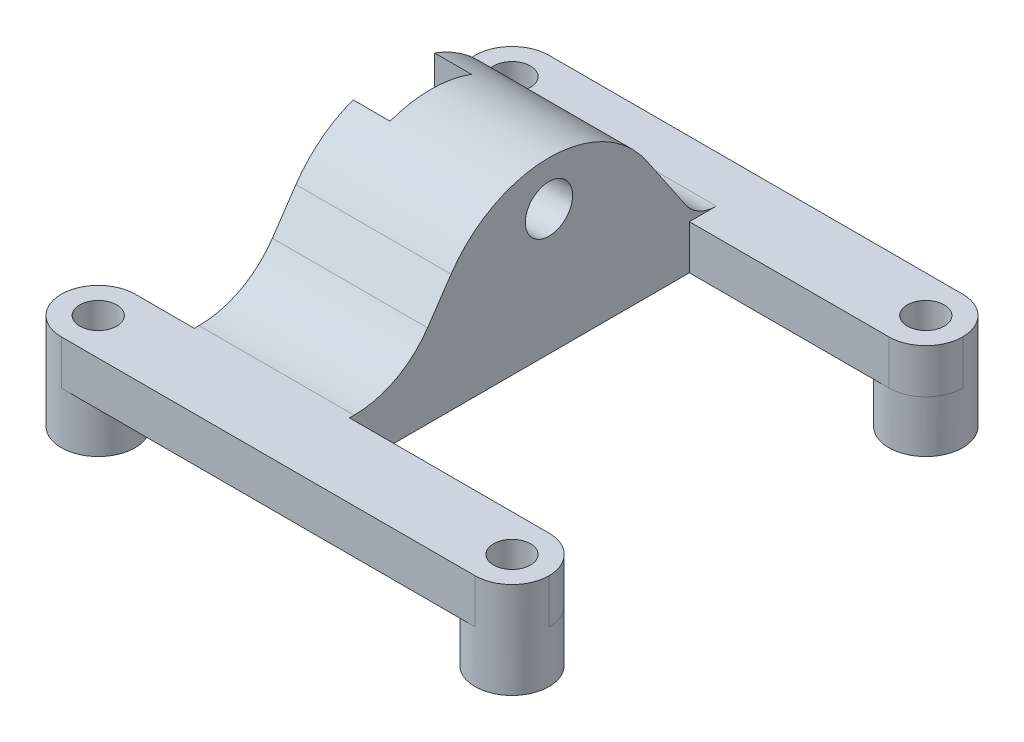
ISO-10303-21;
HEADER;
FILE_DESCRIPTION(('STEP AP214'),'2;1');
FILE_NAME('part.step','',(''),(''),'','','');
FILE_SCHEMA(('AUTOMOTIVE_DESIGN { 1 0 10303 214 1 1 1 1 }'));
ENDSEC;
DATA;
#1=APPLICATION_CONTEXT('core data for automotive mechanical design processes');
#2=APPLICATION_PROTOCOL_DEFINITION('international standard','automotive_design',2000,#1);
#3=PRODUCT_CONTEXT('',#1,'mechanical');
#4=PRODUCT('Part','Part','',(#3));
#5=PRODUCT_RELATED_PRODUCT_CATEGORY('part','',(#4));
#6=PRODUCT_DEFINITION_FORMATION('','',#4);
#7=PRODUCT_DEFINITION_CONTEXT('part definition',#1,'design');
#8=PRODUCT_DEFINITION('design','',#6,#7);
#9=PRODUCT_DEFINITION_SHAPE('','',#8);
#10=(LENGTH_UNIT() NAMED_UNIT(*) SI_UNIT(.MILLI.,.METRE.));
#11=(NAMED_UNIT(*) PLANE_ANGLE_UNIT() SI_UNIT($,.RADIAN.));
#12=(NAMED_UNIT(*) SI_UNIT($,.STERADIAN.) SOLID_ANGLE_UNIT());
#13=UNCERTAINTY_MEASURE_WITH_UNIT(LENGTH_MEASURE(1.E-05),#10,'distance_accuracy_value','');
#14=(GEOMETRIC_REPRESENTATION_CONTEXT(3) GLOBAL_UNCERTAINTY_ASSIGNED_CONTEXT((#13)) GLOBAL_UNIT_ASSIGNED_CONTEXT((#10,
#11,#12)) REPRESENTATION_CONTEXT('',''));
#15=CARTESIAN_POINT('',(0.,0.,0.));
#16=DIRECTION('',(0.,0.,1.));
#17=DIRECTION('',(1.,0.,0.));
#18=AXIS2_PLACEMENT_3D('',#15,#16,#17);
#19=CARTESIAN_POINT('',(38.2313138121007,5.5,-13.3264009035346));
#20=DIRECTION('',(-1.,0.,0.));
#21=DIRECTION('',(0.,0.,1.));
#22=AXIS2_PLACEMENT_3D('',#19,#20,#21);
#23=CYLINDRICAL_SURFACE('',#22,2.5);
#24=DIRECTION('',(-1.,0.,0.));
#25=VECTOR('',#24,1.);
#26=CARTESIAN_POINT('',(0.,3.,-13.3264009035346));
#27=LINE('',#26,#25);
#28=CARTESIAN_POINT('',(-10.,3.,-13.3264009035346));
#29=VERTEX_POINT('',#28);
#30=CARTESIAN_POINT('',(0.5,3.,-13.3264009035346));
#31=VERTEX_POINT('',#30);
#32=EDGE_CURVE('E47',#29,#31,#27,.F.);
#33=ORIENTED_EDGE('',*,*,#32,.F.);
#34=CARTESIAN_POINT('',(-10.,5.5,-13.3264009035346));
#35=DIRECTION('',(1.,0.,0.));
#36=DIRECTION('',(0.,0.,-1.));
#37=AXIS2_PLACEMENT_3D('',#34,#35,#36);
#38=CIRCLE('',#37,2.5);
#39=CARTESIAN_POINT('',(-10.,4.09830491536256,-11.2563161493027));
#40=VERTEX_POINT('',#39);
#41=EDGE_CURVE('E217',#40,#29,#38,.T.);
#42=ORIENTED_EDGE('',*,*,#41,.F.);
#43=DIRECTION('',(-1.,0.,0.));
#44=VECTOR('',#43,1.);
#45=CARTESIAN_POINT('',(38.2313138121007,4.09830491536256,-11.2563161493027));
#46=LINE('',#45,#44);
#47=CARTESIAN_POINT('',(0.5,4.09830491536256,-11.2563161493027));
#48=VERTEX_POINT('',#47);
#49=EDGE_CURVE('E405',#48,#40,#46,.T.);
#50=ORIENTED_EDGE('',*,*,#49,.F.);
#51=CARTESIAN_POINT('',(0.5,5.5,-13.3264009035346));
#52=DIRECTION('',(-1.,0.,0.));
#53=DIRECTION('',(0.,0.,1.));
#54=AXIS2_PLACEMENT_3D('',#51,#52,#53);
#55=CIRCLE('',#54,2.5);
#56=EDGE_CURVE('E410',#31,#48,#55,.T.);
#57=ORIENTED_EDGE('',*,*,#56,.F.);
#58=EDGE_LOOP('',(#33,#42,#50,#57));
#59=FACE_BOUND('',#58,.T.);
#60=ADVANCED_FACE('F32',(#59),#23,.F.);
#61=CARTESIAN_POINT('',(-14.,3.,-14.));
#62=DIRECTION('',(0.,-1.,0.));
#63=DIRECTION('',(0.,0.,-1.));
#64=AXIS2_PLACEMENT_3D('',#61,#62,#63);
#65=CYLINDRICAL_SURFACE('',#64,1.25);
#66=CARTESIAN_POINT('',(-14.,-3.5,-14.));
#67=DIRECTION('',(0.,-1.,0.));
#68=DIRECTION('',(0.,0.,-1.));
#69=AXIS2_PLACEMENT_3D('',#66,#67,#68);
#70=CIRCLE('',#69,1.25);
#71=CARTESIAN_POINT('',(-14.,-3.5,-15.25));
#72=VERTEX_POINT('',#71);
#73=EDGE_CURVE('E282',#72,#72,#70,.T.);
#74=ORIENTED_EDGE('',*,*,#73,.T.);
#75=EDGE_LOOP('',(#74));
#76=FACE_BOUND('',#75,.T.);
#77=CARTESIAN_POINT('',(-14.,3.,-14.));
#78=DIRECTION('',(0.,1.,0.));
#79=DIRECTION('',(0.,0.,1.));
#80=AXIS2_PLACEMENT_3D('',#77,#78,#79);
#81=CIRCLE('',#80,1.25);
#82=CARTESIAN_POINT('',(-14.,3.,-12.75));
#83=VERTEX_POINT('',#82);
#84=EDGE_CURVE('E332',#83,#83,#81,.T.);
#85=ORIENTED_EDGE('',*,*,#84,.T.);
#86=EDGE_LOOP('',(#85));
#87=FACE_BOUND('',#86,.T.);
#88=ADVANCED_FACE('F546',(#76,#87),#65,.F.);
#89=CARTESIAN_POINT('',(-16.5,-3.5,-11.5));
#90=DIRECTION('',(0.,0.,-1.));
#91=DIRECTION('',(-1.,0.,0.));
#92=AXIS2_PLACEMENT_3D('',#89,#90,#91);
#93=PLANE('',#92);
#94=DIRECTION('',(1.,0.,0.));
#95=VECTOR('',#94,1.);
#96=CARTESIAN_POINT('',(-16.5,3.,-11.5));
#97=LINE('',#96,#95);
#98=CARTESIAN_POINT('',(-14.,3.,-11.5));
#99=VERTEX_POINT('',#98);
#100=CARTESIAN_POINT('',(-10.,3.,-11.5));
#101=VERTEX_POINT('',#100);
#102=EDGE_CURVE('E218',#99,#101,#97,.T.);
#103=ORIENTED_EDGE('',*,*,#102,.F.);
#104=DIRECTION('',(0.,1.,0.));
#105=VECTOR('',#104,1.);
#106=CARTESIAN_POINT('',(-14.,-3.5,-11.5));
#107=LINE('',#106,#105);
#108=CARTESIAN_POINT('',(-14.,0.,-11.5));
#109=VERTEX_POINT('',#108);
#110=EDGE_CURVE('E403',#99,#109,#107,.F.);
#111=ORIENTED_EDGE('',*,*,#110,.T.);
#112=DIRECTION('',(-1.,0.,0.));
#113=VECTOR('',#112,1.);
#114=CARTESIAN_POINT('',(0.,0.,-11.5));
#115=LINE('',#114,#113);
#116=CARTESIAN_POINT('',(-10.,0.,-11.5));
#117=VERTEX_POINT('',#116);
#118=EDGE_CURVE('E231',#117,#109,#115,.T.);
#119=ORIENTED_EDGE('',*,*,#118,.F.);
#120=DIRECTION('',(0.,1.,0.));
#121=VECTOR('',#120,1.);
#122=CARTESIAN_POINT('',(-10.,-3.5,-11.5));
#123=LINE('',#122,#121);
#124=EDGE_CURVE('E214',#117,#101,#123,.T.);
#125=ORIENTED_EDGE('',*,*,#124,.T.);
#126=EDGE_LOOP('',(#103,#111,#119,#125));
#127=FACE_BOUND('',#126,.T.);
#128=ADVANCED_FACE('F229',(#127),#93,.F.);
#129=CARTESIAN_POINT('',(-14.,3.,-14.));
#130=DIRECTION('',(0.,1.,0.));
#131=DIRECTION('',(0.,0.,1.));
#132=AXIS2_PLACEMENT_3D('',#129,#130,#131);
#133=CYLINDRICAL_SURFACE('',#132,2.5);
#134=ORIENTED_EDGE('',*,*,#110,.F.);
#135=CARTESIAN_POINT('',(-14.,3.,-14.));
#136=DIRECTION('',(0.,1.,0.));
#137=DIRECTION('',(0.,0.,1.));
#138=AXIS2_PLACEMENT_3D('',#135,#136,#137);
#139=CIRCLE('',#138,2.5);
#140=CARTESIAN_POINT('',(-16.5,3.,-14.));
#141=VERTEX_POINT('',#140);
#142=EDGE_CURVE('E224',#141,#99,#139,.T.);
#143=ORIENTED_EDGE('',*,*,#142,.F.);
#144=DIRECTION('',(0.,-1.,0.));
#145=VECTOR('',#144,1.);
#146=CARTESIAN_POINT('',(-16.5,3.,-14.));
#147=LINE('',#146,#145);
#148=CARTESIAN_POINT('',(-16.5,0.,-14.));
#149=VERTEX_POINT('',#148);
#150=EDGE_CURVE('E349',#141,#149,#147,.T.);
#151=ORIENTED_EDGE('',*,*,#150,.T.);
#152=CARTESIAN_POINT('',(-14.,0.,-14.));
#153=DIRECTION('',(0.,-1.,0.));
#154=DIRECTION('',(0.,0.,-1.));
#155=AXIS2_PLACEMENT_3D('',#152,#153,#154);
#156=CIRCLE('',#155,2.5);
#157=EDGE_CURVE('E285',#109,#149,#156,.T.);
#158=ORIENTED_EDGE('',*,*,#157,.F.);
#159=EDGE_LOOP('',(#134,#143,#151,#158));
#160=FACE_BOUND('',#159,.T.);
#161=ADVANCED_FACE('F536',(#160),#133,.T.);
#162=CARTESIAN_POINT('',(14.,3.,-14.));
#163=DIRECTION('',(0.,-1.,0.));
#164=DIRECTION('',(0.,0.,-1.));
#165=AXIS2_PLACEMENT_3D('',#162,#163,#164);
#166=CYLINDRICAL_SURFACE('',#165,1.25);
#167=CARTESIAN_POINT('',(14.,-3.5,-14.));
#168=DIRECTION('',(0.,-1.,0.));
#169=DIRECTION('',(0.,0.,-1.));
#170=AXIS2_PLACEMENT_3D('',#167,#168,#169);
#171=CIRCLE('',#170,1.25);
#172=CARTESIAN_POINT('',(14.,-3.5,-15.25));
#173=VERTEX_POINT('',#172);
#174=EDGE_CURVE('E289',#173,#173,#171,.T.);
#175=ORIENTED_EDGE('',*,*,#174,.T.);
#176=EDGE_LOOP('',(#175));
#177=FACE_BOUND('',#176,.T.);
#178=CARTESIAN_POINT('',(14.,3.,-14.));
#179=DIRECTION('',(0.,1.,0.));
#180=DIRECTION('',(0.,0.,1.));
#181=AXIS2_PLACEMENT_3D('',#178,#179,#180);
#182=CIRCLE('',#181,1.25);
#183=CARTESIAN_POINT('',(14.,3.,-12.75));
#184=VERTEX_POINT('',#183);
#185=EDGE_CURVE('E329',#184,#184,#182,.T.);
#186=ORIENTED_EDGE('',*,*,#185,.T.);
#187=EDGE_LOOP('',(#186));
#188=FACE_BOUND('',#187,.T.);
#189=ADVANCED_FACE('F538',(#177,#188),#166,.F.);
#190=CARTESIAN_POINT('',(16.5,-3.5,-11.5));
#191=DIRECTION('',(0.,0.,-1.));
#192=DIRECTION('',(-1.,0.,0.));
#193=AXIS2_PLACEMENT_3D('',#190,#191,#192);
#194=PLANE('',#193);
#195=DIRECTION('',(-1.,0.,0.));
#196=VECTOR('',#195,1.);
#197=CARTESIAN_POINT('',(16.5,3.,-11.5));
#198=LINE('',#197,#196);
#199=CARTESIAN_POINT('',(14.,3.,-11.5));
#200=VERTEX_POINT('',#199);
#201=CARTESIAN_POINT('',(0.500000000000004,3.,-11.5));
#202=VERTEX_POINT('',#201);
#203=EDGE_CURVE('E506',#200,#202,#198,.T.);
#204=ORIENTED_EDGE('',*,*,#203,.T.);
#205=DIRECTION('',(0.,1.,0.));
#206=VECTOR('',#205,1.);
#207=CARTESIAN_POINT('',(0.500000000000004,-3.5,-11.5));
#208=LINE('',#207,#206);
#209=CARTESIAN_POINT('',(0.500000000000004,0.,-11.5));
#210=VERTEX_POINT('',#209);
#211=EDGE_CURVE('E232',#210,#202,#208,.T.);
#212=ORIENTED_EDGE('',*,*,#211,.F.);
#213=DIRECTION('',(-1.,0.,0.));
#214=VECTOR('',#213,1.);
#215=CARTESIAN_POINT('',(0.,0.,-11.5));
#216=LINE('',#215,#214);
#217=CARTESIAN_POINT('',(14.,0.,-11.5));
#218=VERTEX_POINT('',#217);
#219=EDGE_CURVE('E262',#218,#210,#216,.T.);
#220=ORIENTED_EDGE('',*,*,#219,.F.);
#221=DIRECTION('',(0.,1.,0.));
#222=VECTOR('',#221,1.);
#223=CARTESIAN_POINT('',(14.,-3.5,-11.5));
#224=LINE('',#223,#222);
#225=EDGE_CURVE('E383',#218,#200,#224,.T.);
#226=ORIENTED_EDGE('',*,*,#225,.T.);
#227=EDGE_LOOP('',(#204,#212,#220,#226));
#228=FACE_BOUND('',#227,.T.);
#229=ADVANCED_FACE('F513',(#228),#194,.F.);
#230=CARTESIAN_POINT('',(14.,-3.5,-14.));
#231=DIRECTION('',(0.,1.,0.));
#232=DIRECTION('',(0.,0.,1.));
#233=AXIS2_PLACEMENT_3D('',#230,#231,#232);
#234=CYLINDRICAL_SURFACE('',#233,2.5);
#235=CARTESIAN_POINT('',(14.,3.,-14.));
#236=DIRECTION('',(0.,1.,0.));
#237=DIRECTION('',(0.,0.,1.));
#238=AXIS2_PLACEMENT_3D('',#235,#236,#237);
#239=CIRCLE('',#238,2.5);
#240=CARTESIAN_POINT('',(16.5,3.,-14.));
#241=VERTEX_POINT('',#240);
#242=EDGE_CURVE('E392',#200,#241,#239,.T.);
#243=ORIENTED_EDGE('',*,*,#242,.F.);
#244=ORIENTED_EDGE('',*,*,#225,.F.);
#245=CARTESIAN_POINT('',(14.,0.,-14.));
#246=DIRECTION('',(0.,-1.,0.));
#247=DIRECTION('',(0.,0.,-1.));
#248=AXIS2_PLACEMENT_3D('',#245,#246,#247);
#249=CIRCLE('',#248,2.5);
#250=CARTESIAN_POINT('',(16.5,0.,-14.));
#251=VERTEX_POINT('',#250);
#252=EDGE_CURVE('E300',#251,#218,#249,.T.);
#253=ORIENTED_EDGE('',*,*,#252,.F.);
#254=DIRECTION('',(0.,-1.,0.));
#255=VECTOR('',#254,1.);
#256=CARTESIAN_POINT('',(16.5,3.,-14.));
#257=LINE('',#256,#255);
#258=EDGE_CURVE('E370',#251,#241,#257,.F.);
#259=ORIENTED_EDGE('',*,*,#258,.T.);
#260=EDGE_LOOP('',(#243,#244,#253,#259));
#261=FACE_BOUND('',#260,.T.);
#262=ADVANCED_FACE('F518',(#261),#234,.T.);
#263=CARTESIAN_POINT('',(0.,0.,0.));
#264=DIRECTION('',(0.,1.,0.));
#265=DIRECTION('',(0.,0.,1.));
#266=AXIS2_PLACEMENT_3D('',#263,#264,#265);
#267=PLANE('',#266);
#268=DIRECTION('',(0.,0.,1.));
#269=VECTOR('',#268,1.);
#270=CARTESIAN_POINT('',(0.500000000000004,0.,0.));
#271=LINE('',#270,#269);
#272=CARTESIAN_POINT('',(0.500000000000004,0.,11.5));
#273=VERTEX_POINT('',#272);
#274=EDGE_CURVE('E258',#210,#273,#271,.T.);
#275=ORIENTED_EDGE('',*,*,#274,.T.);
#276=DIRECTION('',(1.,0.,0.));
#277=VECTOR('',#276,1.);
#278=CARTESIAN_POINT('',(0.,0.,11.5));
#279=LINE('',#278,#277);
#280=CARTESIAN_POINT('',(14.,0.,11.5));
#281=VERTEX_POINT('',#280);
#282=EDGE_CURVE('E265',#273,#281,#279,.T.);
#283=ORIENTED_EDGE('',*,*,#282,.T.);
#284=CARTESIAN_POINT('',(14.,0.,14.));
#285=DIRECTION('',(0.,-1.,0.));
#286=DIRECTION('',(0.,0.,-1.));
#287=AXIS2_PLACEMENT_3D('',#284,#285,#286);
#288=CIRCLE('',#287,2.5);
#289=CARTESIAN_POINT('',(14.,0.,16.5));
#290=VERTEX_POINT('',#289);
#291=EDGE_CURVE('E310',#290,#281,#288,.T.);
#292=ORIENTED_EDGE('',*,*,#291,.F.);
#293=DIRECTION('',(1.,0.,0.));
#294=VECTOR('',#293,1.);
#295=CARTESIAN_POINT('',(-16.5,0.,16.5));
#296=LINE('',#295,#294);
#297=CARTESIAN_POINT('',(-14.,0.,16.5));
#298=VERTEX_POINT('',#297);
#299=EDGE_CURVE('E335',#298,#290,#296,.T.);
#300=ORIENTED_EDGE('',*,*,#299,.F.);
#301=CARTESIAN_POINT('',(-14.,0.,14.));
#302=DIRECTION('',(0.,-1.,0.));
#303=DIRECTION('',(0.,0.,-1.));
#304=AXIS2_PLACEMENT_3D('',#301,#302,#303);
#305=CIRCLE('',#304,2.5);
#306=CARTESIAN_POINT('',(-14.,0.,11.5));
#307=VERTEX_POINT('',#306);
#308=EDGE_CURVE('E323',#307,#298,#305,.T.);
#309=ORIENTED_EDGE('',*,*,#308,.F.);
#310=DIRECTION('',(1.,0.,0.));
#311=VECTOR('',#310,1.);
#312=CARTESIAN_POINT('',(0.,0.,11.5));
#313=LINE('',#312,#311);
#314=CARTESIAN_POINT('',(-10.,0.,11.5));
#315=VERTEX_POINT('',#314);
#316=EDGE_CURVE('E271',#307,#315,#313,.T.);
#317=ORIENTED_EDGE('',*,*,#316,.T.);
#318=DIRECTION('',(0.,0.,-1.));
#319=VECTOR('',#318,1.);
#320=CARTESIAN_POINT('',(-10.,0.,0.));
#321=LINE('',#320,#319);
#322=EDGE_CURVE('E249',#315,#117,#321,.T.);
#323=ORIENTED_EDGE('',*,*,#322,.T.);
#324=ORIENTED_EDGE('',*,*,#118,.T.);
#325=CARTESIAN_POINT('',(-14.,0.,-16.5));
#326=VERTEX_POINT('',#325);
#327=EDGE_CURVE('E290',#326,#109,#156,.T.);
#328=ORIENTED_EDGE('',*,*,#327,.F.);
#329=DIRECTION('',(-1.,0.,0.));
#330=VECTOR('',#329,1.);
#331=CARTESIAN_POINT('',(-16.5,0.,-16.5));
#332=LINE('',#331,#330);
#333=CARTESIAN_POINT('',(14.,0.,-16.5));
#334=VERTEX_POINT('',#333);
#335=EDGE_CURVE('E340',#334,#326,#332,.T.);
#336=ORIENTED_EDGE('',*,*,#335,.F.);
#337=EDGE_CURVE('E295',#218,#334,#249,.T.);
#338=ORIENTED_EDGE('',*,*,#337,.F.);
#339=ORIENTED_EDGE('',*,*,#219,.T.);
#340=EDGE_LOOP('',(#275,#283,#292,#300,#309,#317,#323,#324,#328,#336,#338,#339));
#341=FACE_BOUND('',#340,.T.);
#342=ADVANCED_FACE('F440',(#341),#267,.F.);
#343=CARTESIAN_POINT('',(0.,3.,0.));
#344=DIRECTION('',(0.,1.,0.));
#345=DIRECTION('',(0.,0.,1.));
#346=AXIS2_PLACEMENT_3D('',#343,#344,#345);
#347=PLANE('',#346);
#348=DIRECTION('',(0.,0.,1.));
#349=VECTOR('',#348,1.);
#350=CARTESIAN_POINT('',(0.500000000000004,3.,0.));
#351=LINE('',#350,#349);
#352=CARTESIAN_POINT('',(0.500000000000004,3.,11.1833621684831));
#353=VERTEX_POINT('',#352);
#354=CARTESIAN_POINT('',(0.500000000000004,3.,11.5));
#355=VERTEX_POINT('',#354);
#356=EDGE_CURVE('E256',#353,#355,#351,.T.);
#357=ORIENTED_EDGE('',*,*,#356,.F.);
#358=DIRECTION('',(-1.,0.,0.));
#359=VECTOR('',#358,1.);
#360=CARTESIAN_POINT('',(0.,3.,11.1833621684831));
#361=LINE('',#360,#359);
#362=CARTESIAN_POINT('',(-10.,3.,11.1833621684831));
#363=VERTEX_POINT('',#362);
#364=EDGE_CURVE('E412',#353,#363,#361,.T.);
#365=ORIENTED_EDGE('',*,*,#364,.T.);
#366=DIRECTION('',(0.,0.,-1.));
#367=VECTOR('',#366,1.);
#368=CARTESIAN_POINT('',(-10.,3.,0.));
#369=LINE('',#368,#367);
#370=CARTESIAN_POINT('',(-10.,3.,11.5));
#371=VERTEX_POINT('',#370);
#372=EDGE_CURVE('E247',#371,#363,#369,.T.);
#373=ORIENTED_EDGE('',*,*,#372,.F.);
#374=DIRECTION('',(1.,0.,0.));
#375=VECTOR('',#374,1.);
#376=CARTESIAN_POINT('',(0.,3.,11.5));
#377=LINE('',#376,#375);
#378=CARTESIAN_POINT('',(-14.,3.,11.5));
#379=VERTEX_POINT('',#378);
#380=EDGE_CURVE('E274',#379,#371,#377,.T.);
#381=ORIENTED_EDGE('',*,*,#380,.F.);
#382=CARTESIAN_POINT('',(-14.,3.,14.));
#383=DIRECTION('',(0.,1.,0.));
#384=DIRECTION('',(0.,0.,1.));
#385=AXIS2_PLACEMENT_3D('',#382,#383,#384);
#386=CIRCLE('',#385,2.5);
#387=CARTESIAN_POINT('',(-16.5,3.,14.));
#388=VERTEX_POINT('',#387);
#389=EDGE_CURVE('E394',#379,#388,#386,.T.);
#390=ORIENTED_EDGE('',*,*,#389,.T.);
#391=CARTESIAN_POINT('',(-14.,3.,14.));
#392=DIRECTION('',(0.,1.,0.));
#393=DIRECTION('',(0.,0.,1.));
#394=AXIS2_PLACEMENT_3D('',#391,#392,#393);
#395=CIRCLE('',#394,2.5);
#396=CARTESIAN_POINT('',(-14.,3.,16.5));
#397=VERTEX_POINT('',#396);
#398=EDGE_CURVE('E358',#388,#397,#395,.T.);
#399=ORIENTED_EDGE('',*,*,#398,.T.);
#400=DIRECTION('',(1.,0.,0.));
#401=VECTOR('',#400,1.);
#402=CARTESIAN_POINT('',(-16.5,3.,16.5));
#403=LINE('',#402,#401);
#404=CARTESIAN_POINT('',(14.,3.,16.5));
#405=VERTEX_POINT('',#404);
#406=EDGE_CURVE('E336',#397,#405,#403,.T.);
#407=ORIENTED_EDGE('',*,*,#406,.T.);
#408=CARTESIAN_POINT('',(14.,3.,14.));
#409=DIRECTION('',(0.,1.,0.));
#410=DIRECTION('',(0.,0.,1.));
#411=AXIS2_PLACEMENT_3D('',#408,#409,#410);
#412=CIRCLE('',#411,2.5);
#413=CARTESIAN_POINT('',(16.5,3.,14.));
#414=VERTEX_POINT('',#413);
#415=EDGE_CURVE('E360',#405,#414,#412,.T.);
#416=ORIENTED_EDGE('',*,*,#415,.T.);
#417=CARTESIAN_POINT('',(14.,3.,14.));
#418=DIRECTION('',(0.,1.,0.));
#419=DIRECTION('',(0.,0.,1.));
#420=AXIS2_PLACEMENT_3D('',#417,#418,#419);
#421=CIRCLE('',#420,2.5);
#422=CARTESIAN_POINT('',(14.,3.,11.5));
#423=VERTEX_POINT('',#422);
#424=EDGE_CURVE('E396',#414,#423,#421,.T.);
#425=ORIENTED_EDGE('',*,*,#424,.T.);
#426=DIRECTION('',(1.,0.,0.));
#427=VECTOR('',#426,1.);
#428=CARTESIAN_POINT('',(0.,3.,11.5));
#429=LINE('',#428,#427);
#430=EDGE_CURVE('E268',#355,#423,#429,.T.);
#431=ORIENTED_EDGE('',*,*,#430,.F.);
#432=EDGE_LOOP('',(#357,#365,#373,#381,#390,#399,#407,#416,#425,#431));
#433=FACE_BOUND('',#432,.T.);
#434=CARTESIAN_POINT('',(14.,3.,14.));
#435=DIRECTION('',(0.,1.,0.));
#436=DIRECTION('',(0.,0.,1.));
#437=AXIS2_PLACEMENT_3D('',#434,#435,#436);
#438=CIRCLE('',#437,1.25);
#439=CARTESIAN_POINT('',(14.,3.,15.25));
#440=VERTEX_POINT('',#439);
#441=EDGE_CURVE('E318',#440,#440,#438,.T.);
#442=ORIENTED_EDGE('',*,*,#441,.F.);
#443=EDGE_LOOP('',(#442));
#444=FACE_BOUND('',#443,.T.);
#445=CARTESIAN_POINT('',(-14.,3.,14.));
#446=DIRECTION('',(0.,1.,0.));
#447=DIRECTION('',(0.,0.,1.));
#448=AXIS2_PLACEMENT_3D('',#445,#446,#447);
#449=CIRCLE('',#448,1.25);
#450=CARTESIAN_POINT('',(-14.,3.,15.25));
#451=VERTEX_POINT('',#450);
#452=EDGE_CURVE('E326',#451,#451,#449,.T.);
#453=ORIENTED_EDGE('',*,*,#452,.F.);
#454=EDGE_LOOP('',(#453));
#455=FACE_BOUND('',#454,.T.);
#456=ADVANCED_FACE('F431',(#433,#444,#455),#347,.T.);
#457=ORIENTED_EDGE('',*,*,#84,.F.);
#458=EDGE_LOOP('',(#457));
#459=FACE_BOUND('',#458,.T.);
#460=ORIENTED_EDGE('',*,*,#142,.T.);
#461=ORIENTED_EDGE('',*,*,#102,.T.);
#462=DIRECTION('',(0.,0.,1.));
#463=VECTOR('',#462,1.);
#464=CARTESIAN_POINT('',(-10.,3.,-16.5));
#465=LINE('',#464,#463);
#466=EDGE_CURVE('E209',#29,#101,#465,.T.);
#467=ORIENTED_EDGE('',*,*,#466,.F.);
#468=ORIENTED_EDGE('',*,*,#32,.T.);
#469=DIRECTION('',(0.,0.,-1.));
#470=VECTOR('',#469,1.);
#471=CARTESIAN_POINT('',(0.500000000000004,3.,-16.5));
#472=LINE('',#471,#470);
#473=EDGE_CURVE('E227',#202,#31,#472,.T.);
#474=ORIENTED_EDGE('',*,*,#473,.F.);
#475=ORIENTED_EDGE('',*,*,#203,.F.);
#476=ORIENTED_EDGE('',*,*,#242,.T.);
#477=CARTESIAN_POINT('',(14.,3.,-14.));
#478=DIRECTION('',(0.,1.,0.));
#479=DIRECTION('',(0.,0.,1.));
#480=AXIS2_PLACEMENT_3D('',#477,#478,#479);
#481=CIRCLE('',#480,2.5);
#482=CARTESIAN_POINT('',(14.,3.,-16.5));
#483=VERTEX_POINT('',#482);
#484=EDGE_CURVE('E363',#241,#483,#481,.T.);
#485=ORIENTED_EDGE('',*,*,#484,.T.);
#486=DIRECTION('',(-1.,0.,0.));
#487=VECTOR('',#486,1.);
#488=CARTESIAN_POINT('',(-16.5,3.,-16.5));
#489=LINE('',#488,#487);
#490=CARTESIAN_POINT('',(-14.,3.,-16.5));
#491=VERTEX_POINT('',#490);
#492=EDGE_CURVE('E339',#483,#491,#489,.T.);
#493=ORIENTED_EDGE('',*,*,#492,.T.);
#494=CARTESIAN_POINT('',(-14.,3.,-14.));
#495=DIRECTION('',(0.,1.,0.));
#496=DIRECTION('',(0.,0.,1.));
#497=AXIS2_PLACEMENT_3D('',#494,#495,#496);
#498=CIRCLE('',#497,2.5);
#499=EDGE_CURVE('E365',#491,#141,#498,.T.);
#500=ORIENTED_EDGE('',*,*,#499,.T.);
#501=EDGE_LOOP('',(#460,#461,#467,#468,#474,#475,#476,#485,#493,#500));
#502=FACE_BOUND('',#501,.T.);
#503=ORIENTED_EDGE('',*,*,#185,.F.);
#504=EDGE_LOOP('',(#503));
#505=FACE_BOUND('',#504,.T.);
#506=ADVANCED_FACE('F221',(#459,#502,#505),#347,.T.);
#507=CARTESIAN_POINT('',(-16.5,3.,16.5));
#508=DIRECTION('',(0.,0.,-1.));
#509=DIRECTION('',(-1.,0.,0.));
#510=AXIS2_PLACEMENT_3D('',#507,#508,#509);
#511=PLANE('',#510);
#512=ORIENTED_EDGE('',*,*,#299,.T.);
#513=DIRECTION('',(0.,-1.,0.));
#514=VECTOR('',#513,1.);
#515=CARTESIAN_POINT('',(14.,3.,16.5));
#516=LINE('',#515,#514);
#517=EDGE_CURVE('E376',#290,#405,#516,.F.);
#518=ORIENTED_EDGE('',*,*,#517,.T.);
#519=ORIENTED_EDGE('',*,*,#406,.F.);
#520=DIRECTION('',(0.,-1.,0.));
#521=VECTOR('',#520,1.);
#522=CARTESIAN_POINT('',(-14.,3.,16.5));
#523=LINE('',#522,#521);
#524=EDGE_CURVE('E373',#397,#298,#523,.T.);
#525=ORIENTED_EDGE('',*,*,#524,.T.);
#526=EDGE_LOOP('',(#512,#518,#519,#525));
#527=FACE_BOUND('',#526,.T.);
#528=ADVANCED_FACE('F454',(#527),#511,.F.);
#529=CARTESIAN_POINT('',(-16.5,3.,-16.5));
#530=DIRECTION('',(0.,0.,1.));
#531=DIRECTION('',(1.,0.,0.));
#532=AXIS2_PLACEMENT_3D('',#529,#530,#531);
#533=PLANE('',#532);
#534=ORIENTED_EDGE('',*,*,#335,.T.);
#535=DIRECTION('',(0.,-1.,0.));
#536=VECTOR('',#535,1.);
#537=CARTESIAN_POINT('',(-14.,3.,-16.5));
#538=LINE('',#537,#536);
#539=EDGE_CURVE('E355',#326,#491,#538,.F.);
#540=ORIENTED_EDGE('',*,*,#539,.T.);
#541=ORIENTED_EDGE('',*,*,#492,.F.);
#542=DIRECTION('',(0.,-1.,0.));
#543=VECTOR('',#542,1.);
#544=CARTESIAN_POINT('',(14.,3.,-16.5));
#545=LINE('',#544,#543);
#546=EDGE_CURVE('E352',#483,#334,#545,.T.);
#547=ORIENTED_EDGE('',*,*,#546,.T.);
#548=EDGE_LOOP('',(#534,#540,#541,#547));
#549=FACE_BOUND('',#548,.T.);
#550=ADVANCED_FACE('F527',(#549),#533,.F.);
#551=CARTESIAN_POINT('',(-14.,3.,14.));
#552=DIRECTION('',(0.,-1.,0.));
#553=DIRECTION('',(0.,0.,-1.));
#554=AXIS2_PLACEMENT_3D('',#551,#552,#553);
#555=CYLINDRICAL_SURFACE('',#554,1.25);
#556=ORIENTED_EDGE('',*,*,#452,.T.);
#557=EDGE_LOOP('',(#556));
#558=FACE_BOUND('',#557,.T.);
#559=CARTESIAN_POINT('',(-14.,-3.5,14.));
#560=DIRECTION('',(0.,-1.,0.));
#561=DIRECTION('',(0.,0.,-1.));
#562=AXIS2_PLACEMENT_3D('',#559,#560,#561);
#563=CIRCLE('',#562,1.25);
#564=CARTESIAN_POINT('',(-14.,-3.5,12.75));
#565=VERTEX_POINT('',#564);
#566=EDGE_CURVE('E309',#565,#565,#563,.T.);
#567=ORIENTED_EDGE('',*,*,#566,.T.);
#568=EDGE_LOOP('',(#567));
#569=FACE_BOUND('',#568,.T.);
#570=ADVANCED_FACE('F636',(#558,#569),#555,.F.);
#571=CARTESIAN_POINT('',(14.,3.,14.));
#572=DIRECTION('',(0.,-1.,0.));
#573=DIRECTION('',(0.,0.,-1.));
#574=AXIS2_PLACEMENT_3D('',#571,#572,#573);
#575=CYLINDRICAL_SURFACE('',#574,1.25);
#576=ORIENTED_EDGE('',*,*,#441,.T.);
#577=EDGE_LOOP('',(#576));
#578=FACE_BOUND('',#577,.T.);
#579=CARTESIAN_POINT('',(14.,-3.5,14.));
#580=DIRECTION('',(0.,-1.,0.));
#581=DIRECTION('',(0.,0.,-1.));
#582=AXIS2_PLACEMENT_3D('',#579,#580,#581);
#583=CIRCLE('',#582,1.25);
#584=CARTESIAN_POINT('',(14.,-3.5,12.75));
#585=VERTEX_POINT('',#584);
#586=EDGE_CURVE('E299',#585,#585,#583,.T.);
#587=ORIENTED_EDGE('',*,*,#586,.T.);
#588=EDGE_LOOP('',(#587));
#589=FACE_BOUND('',#588,.T.);
#590=ADVANCED_FACE('F633',(#578,#589),#575,.F.);
#591=CARTESIAN_POINT('',(-14.,3.,-14.));
#592=DIRECTION('',(0.,-1.,0.));
#593=DIRECTION('',(0.,0.,-1.));
#594=AXIS2_PLACEMENT_3D('',#591,#592,#593);
#595=CYLINDRICAL_SURFACE('',#594,2.5);
#596=ORIENTED_EDGE('',*,*,#327,.T.);
#597=ORIENTED_EDGE('',*,*,#157,.T.);
#598=ORIENTED_EDGE('',*,*,#150,.F.);
#599=ORIENTED_EDGE('',*,*,#499,.F.);
#600=ORIENTED_EDGE('',*,*,#539,.F.);
#601=EDGE_LOOP('',(#596,#597,#598,#599,#600));
#602=FACE_BOUND('',#601,.T.);
#603=CARTESIAN_POINT('',(-14.,-3.5,-14.));
#604=DIRECTION('',(0.,-1.,0.));
#605=DIRECTION('',(0.,0.,-1.));
#606=AXIS2_PLACEMENT_3D('',#603,#604,#605);
#607=CIRCLE('',#606,2.5);
#608=CARTESIAN_POINT('',(-14.,-3.5,-16.5));
#609=VERTEX_POINT('',#608);
#610=EDGE_CURVE('E286',#609,#609,#607,.T.);
#611=ORIENTED_EDGE('',*,*,#610,.F.);
#612=EDGE_LOOP('',(#611));
#613=FACE_BOUND('',#612,.T.);
#614=ADVANCED_FACE('F531',(#602,#613),#595,.T.);
#615=CARTESIAN_POINT('',(14.,3.,-14.));
#616=DIRECTION('',(0.,-1.,0.));
#617=DIRECTION('',(0.,0.,-1.));
#618=AXIS2_PLACEMENT_3D('',#615,#616,#617);
#619=CYLINDRICAL_SURFACE('',#618,2.5);
#620=ORIENTED_EDGE('',*,*,#252,.T.);
#621=ORIENTED_EDGE('',*,*,#337,.T.);
#622=ORIENTED_EDGE('',*,*,#546,.F.);
#623=ORIENTED_EDGE('',*,*,#484,.F.);
#624=ORIENTED_EDGE('',*,*,#258,.F.);
#625=EDGE_LOOP('',(#620,#621,#622,#623,#624));
#626=FACE_BOUND('',#625,.T.);
#627=CARTESIAN_POINT('',(14.,-3.5,-14.));
#628=DIRECTION('',(0.,-1.,0.));
#629=DIRECTION('',(0.,0.,-1.));
#630=AXIS2_PLACEMENT_3D('',#627,#628,#629);
#631=CIRCLE('',#630,2.5);
#632=CARTESIAN_POINT('',(14.,-3.5,-16.5));
#633=VERTEX_POINT('',#632);
#634=EDGE_CURVE('E296',#633,#633,#631,.T.);
#635=ORIENTED_EDGE('',*,*,#634,.F.);
#636=EDGE_LOOP('',(#635));
#637=FACE_BOUND('',#636,.T.);
#638=ADVANCED_FACE('F523',(#626,#637),#619,.T.);
#639=CARTESIAN_POINT('',(14.,3.,14.));
#640=DIRECTION('',(0.,-1.,0.));
#641=DIRECTION('',(0.,0.,-1.));
#642=AXIS2_PLACEMENT_3D('',#639,#640,#641);
#643=CYLINDRICAL_SURFACE('',#642,2.5);
#644=ORIENTED_EDGE('',*,*,#291,.T.);
#645=CARTESIAN_POINT('',(16.5,0.,14.));
#646=VERTEX_POINT('',#645);
#647=EDGE_CURVE('E305',#281,#646,#288,.T.);
#648=ORIENTED_EDGE('',*,*,#647,.T.);
#649=DIRECTION('',(0.,-1.,0.));
#650=VECTOR('',#649,1.);
#651=CARTESIAN_POINT('',(16.5,3.,14.));
#652=LINE('',#651,#650);
#653=EDGE_CURVE('E367',#414,#646,#652,.T.);
#654=ORIENTED_EDGE('',*,*,#653,.F.);
#655=ORIENTED_EDGE('',*,*,#415,.F.);
#656=ORIENTED_EDGE('',*,*,#517,.F.);
#657=EDGE_LOOP('',(#644,#648,#654,#655,#656));
#658=FACE_BOUND('',#657,.T.);
#659=CARTESIAN_POINT('',(14.,-3.5,14.));
#660=DIRECTION('',(0.,-1.,0.));
#661=DIRECTION('',(0.,0.,-1.));
#662=AXIS2_PLACEMENT_3D('',#659,#660,#661);
#663=CIRCLE('',#662,2.5);
#664=CARTESIAN_POINT('',(14.,-3.5,11.5));
#665=VERTEX_POINT('',#664);
#666=EDGE_CURVE('E306',#665,#665,#663,.T.);
#667=ORIENTED_EDGE('',*,*,#666,.F.);
#668=EDGE_LOOP('',(#667));
#669=FACE_BOUND('',#668,.T.);
#670=ADVANCED_FACE('F458',(#658,#669),#643,.T.);
#671=CARTESIAN_POINT('',(-14.,3.,14.));
#672=DIRECTION('',(0.,-1.,0.));
#673=DIRECTION('',(0.,0.,-1.));
#674=AXIS2_PLACEMENT_3D('',#671,#672,#673);
#675=CYLINDRICAL_SURFACE('',#674,2.5);
#676=CARTESIAN_POINT('',(-16.5,0.,14.));
#677=VERTEX_POINT('',#676);
#678=EDGE_CURVE('E319',#677,#307,#305,.T.);
#679=ORIENTED_EDGE('',*,*,#678,.T.);
#680=ORIENTED_EDGE('',*,*,#308,.T.);
#681=ORIENTED_EDGE('',*,*,#524,.F.);
#682=ORIENTED_EDGE('',*,*,#398,.F.);
#683=DIRECTION('',(0.,-1.,0.));
#684=VECTOR('',#683,1.);
#685=CARTESIAN_POINT('',(-16.5,3.,14.));
#686=LINE('',#685,#684);
#687=EDGE_CURVE('E342',#677,#388,#686,.F.);
#688=ORIENTED_EDGE('',*,*,#687,.F.);
#689=EDGE_LOOP('',(#679,#680,#681,#682,#688));
#690=FACE_BOUND('',#689,.T.);
#691=CARTESIAN_POINT('',(-14.,-3.5,14.));
#692=DIRECTION('',(0.,-1.,0.));
#693=DIRECTION('',(0.,0.,-1.));
#694=AXIS2_PLACEMENT_3D('',#691,#692,#693);
#695=CIRCLE('',#694,2.5);
#696=CARTESIAN_POINT('',(-14.,-3.5,11.5));
#697=VERTEX_POINT('',#696);
#698=EDGE_CURVE('E315',#697,#697,#695,.T.);
#699=ORIENTED_EDGE('',*,*,#698,.F.);
#700=EDGE_LOOP('',(#699));
#701=FACE_BOUND('',#700,.T.);
#702=ADVANCED_FACE('F447',(#690,#701),#675,.T.);
#703=CARTESIAN_POINT('',(-14.,-3.5,14.));
#704=DIRECTION('',(0.,-1.,0.));
#705=DIRECTION('',(0.,0.,-1.));
#706=AXIS2_PLACEMENT_3D('',#703,#704,#705);
#707=PLANE('',#706);
#708=ORIENTED_EDGE('',*,*,#698,.T.);
#709=EDGE_LOOP('',(#708));
#710=FACE_BOUND('',#709,.T.);
#711=ORIENTED_EDGE('',*,*,#566,.F.);
#712=EDGE_LOOP('',(#711));
#713=FACE_BOUND('',#712,.T.);
#714=ADVANCED_FACE('F628',(#710,#713),#707,.T.);
#715=CARTESIAN_POINT('',(14.,-3.5,14.));
#716=DIRECTION('',(0.,-1.,0.));
#717=DIRECTION('',(0.,0.,-1.));
#718=AXIS2_PLACEMENT_3D('',#715,#716,#717);
#719=PLANE('',#718);
#720=ORIENTED_EDGE('',*,*,#666,.T.);
#721=EDGE_LOOP('',(#720));
#722=FACE_BOUND('',#721,.T.);
#723=ORIENTED_EDGE('',*,*,#586,.F.);
#724=EDGE_LOOP('',(#723));
#725=FACE_BOUND('',#724,.T.);
#726=ADVANCED_FACE('F624',(#722,#725),#719,.T.);
#727=CARTESIAN_POINT('',(14.,-3.5,-14.));
#728=DIRECTION('',(0.,-1.,0.));
#729=DIRECTION('',(0.,0.,-1.));
#730=AXIS2_PLACEMENT_3D('',#727,#728,#729);
#731=PLANE('',#730);
#732=ORIENTED_EDGE('',*,*,#634,.T.);
#733=EDGE_LOOP('',(#732));
#734=FACE_BOUND('',#733,.T.);
#735=ORIENTED_EDGE('',*,*,#174,.F.);
#736=EDGE_LOOP('',(#735));
#737=FACE_BOUND('',#736,.T.);
#738=ADVANCED_FACE('F620',(#734,#737),#731,.T.);
#739=CARTESIAN_POINT('',(-14.,-3.5,-14.));
#740=DIRECTION('',(0.,-1.,0.));
#741=DIRECTION('',(0.,0.,-1.));
#742=AXIS2_PLACEMENT_3D('',#739,#740,#741);
#743=PLANE('',#742);
#744=ORIENTED_EDGE('',*,*,#610,.T.);
#745=EDGE_LOOP('',(#744));
#746=FACE_BOUND('',#745,.T.);
#747=ORIENTED_EDGE('',*,*,#73,.F.);
#748=EDGE_LOOP('',(#747));
#749=FACE_BOUND('',#748,.T.);
#750=ADVANCED_FACE('F613',(#746,#749),#743,.T.);
#751=CARTESIAN_POINT('',(38.2313138121007,7.98542427083982,-8.62427121354199));
#752=DIRECTION('',(0.,-0.560678033854977,0.828033901692749));
#753=DIRECTION('',(0.,-0.828033901692749,-0.560678033854977));
#754=AXIS2_PLACEMENT_3D('',#751,#752,#753);
#755=PLANE('',#754);
#756=DIRECTION('',(0.,-0.828033901692749,-0.560678033854977));
#757=VECTOR('',#756,1.);
#758=CARTESIAN_POINT('',(0.5,7.98542427083982,-8.62427121354199));
#759=LINE('',#758,#757);
#760=CARTESIAN_POINT('',(0.5,7.98542427083982,-8.62427121354199));
#761=VERTEX_POINT('',#760);
#762=EDGE_CURVE('E253',#761,#48,#759,.T.);
#763=ORIENTED_EDGE('',*,*,#762,.T.);
#764=ORIENTED_EDGE('',*,*,#49,.T.);
#765=DIRECTION('',(0.,0.828033901692749,0.560678033854977));
#766=VECTOR('',#765,1.);
#767=CARTESIAN_POINT('',(-10.,7.98542427083983,-8.62427121354199));
#768=LINE('',#767,#766);
#769=CARTESIAN_POINT('',(-10.,7.98542427083982,-8.62427121354199));
#770=VERTEX_POINT('',#769);
#771=EDGE_CURVE('E245',#40,#770,#768,.T.);
#772=ORIENTED_EDGE('',*,*,#771,.T.);
#773=DIRECTION('',(-1.,0.,0.));
#774=VECTOR('',#773,1.);
#775=CARTESIAN_POINT('',(38.2313138121007,7.98542427083982,-8.62427121354199));
#776=LINE('',#775,#774);
#777=EDGE_CURVE('E276',#761,#770,#776,.T.);
#778=ORIENTED_EDGE('',*,*,#777,.F.);
#779=EDGE_LOOP('',(#763,#764,#772,#778));
#780=FACE_BOUND('',#779,.T.);
#781=ADVANCED_FACE('F558',(#780),#755,.F.);
#782=CARTESIAN_POINT('',(38.2313138121007,7.98542427083982,4.62427121354199));
#783=DIRECTION('',(0.,-0.560678033854977,-0.828033901692749));
#784=DIRECTION('',(0.,0.828033901692749,-0.560678033854977));
#785=AXIS2_PLACEMENT_3D('',#782,#783,#784);
#786=PLANE('',#785);
#787=DIRECTION('',(0.,-0.828033901692749,0.560678033854977));
#788=VECTOR('',#787,1.);
#789=CARTESIAN_POINT('',(-10.,7.98542427083982,4.62427121354199));
#790=LINE('',#789,#788);
#791=CARTESIAN_POINT('',(-10.,7.98542427083982,4.62427121354199));
#792=VERTEX_POINT('',#791);
#793=CARTESIAN_POINT('',(-10.,5.63593179687014,6.21515875832659));
#794=VERTEX_POINT('',#793);
#795=EDGE_CURVE('E243',#792,#794,#790,.T.);
#796=ORIENTED_EDGE('',*,*,#795,.T.);
#797=DIRECTION('',(-1.,0.,0.));
#798=VECTOR('',#797,1.);
#799=CARTESIAN_POINT('',(38.2313138121007,5.63593179687014,6.21515875832659));
#800=LINE('',#799,#798);
#801=CARTESIAN_POINT('',(0.5,5.63593179687014,6.21515875832659));
#802=VERTEX_POINT('',#801);
#803=EDGE_CURVE('E415',#794,#802,#800,.F.);
#804=ORIENTED_EDGE('',*,*,#803,.T.);
#805=DIRECTION('',(0.,0.828033901692749,-0.560678033854977));
#806=VECTOR('',#805,1.);
#807=CARTESIAN_POINT('',(0.5,7.98542427083982,4.62427121354199));
#808=LINE('',#807,#806);
#809=CARTESIAN_POINT('',(0.5,7.98542427083982,4.62427121354199));
#810=VERTEX_POINT('',#809);
#811=EDGE_CURVE('E251',#802,#810,#808,.T.);
#812=ORIENTED_EDGE('',*,*,#811,.T.);
#813=DIRECTION('',(-1.,0.,0.));
#814=VECTOR('',#813,1.);
#815=CARTESIAN_POINT('',(38.2313138121007,7.98542427083982,4.62427121354199));
#816=LINE('',#815,#814);
#817=EDGE_CURVE('E279',#810,#792,#816,.T.);
#818=ORIENTED_EDGE('',*,*,#817,.T.);
#819=EDGE_LOOP('',(#796,#804,#812,#818));
#820=FACE_BOUND('',#819,.T.);
#821=ADVANCED_FACE('F419',(#820),#786,.F.);
#822=CARTESIAN_POINT('',(38.2313138121007,3.5,-2.));
#823=DIRECTION('',(-1.,0.,0.));
#824=DIRECTION('',(0.,0.,1.));
#825=AXIS2_PLACEMENT_3D('',#822,#823,#824);
#826=CYLINDRICAL_SURFACE('',#825,8.);
#827=CARTESIAN_POINT('',(-10.,3.5,-2.));
#828=DIRECTION('',(1.,0.,0.));
#829=DIRECTION('',(0.,0.,-1.));
#830=AXIS2_PLACEMENT_3D('',#827,#828,#829);
#831=CIRCLE('',#830,8.);
#832=CARTESIAN_POINT('',(-10.,11.0124896006584,-4.75));
#833=VERTEX_POINT('',#832);
#834=EDGE_CURVE('E378',#770,#833,#831,.T.);
#835=ORIENTED_EDGE('',*,*,#834,.T.);
#836=DIRECTION('',(-1.,0.,0.));
#837=VECTOR('',#836,1.);
#838=CARTESIAN_POINT('',(-7.50000000000001,11.0124896006584,-4.75));
#839=LINE('',#838,#837);
#840=CARTESIAN_POINT('',(-7.50000000000001,11.0124896006584,-4.75));
#841=VERTEX_POINT('',#840);
#842=EDGE_CURVE('E476',#841,#833,#839,.T.);
#843=ORIENTED_EDGE('',*,*,#842,.F.);
#844=CARTESIAN_POINT('',(-7.50000000000001,3.5,-2.));
#845=DIRECTION('',(-1.,0.,0.));
#846=DIRECTION('',(0.,0.,-1.));
#847=AXIS2_PLACEMENT_3D('',#844,#845,#846);
#848=CIRCLE('',#847,8.);
#849=CARTESIAN_POINT('',(-7.50000000000001,11.0124896006584,0.750000000000002));
#850=VERTEX_POINT('',#849);
#851=EDGE_CURVE('E496',#850,#841,#848,.T.);
#852=ORIENTED_EDGE('',*,*,#851,.F.);
#853=DIRECTION('',(-1.,0.,0.));
#854=VECTOR('',#853,1.);
#855=CARTESIAN_POINT('',(-7.50000000000001,11.0124896006584,0.750000000000002));
#856=LINE('',#855,#854);
#857=CARTESIAN_POINT('',(-10.,11.0124896006584,0.750000000000002));
#858=VERTEX_POINT('',#857);
#859=EDGE_CURVE('E472',#850,#858,#856,.T.);
#860=ORIENTED_EDGE('',*,*,#859,.T.);
#861=EDGE_CURVE('E322',#858,#792,#831,.T.);
#862=ORIENTED_EDGE('',*,*,#861,.T.);
#863=ORIENTED_EDGE('',*,*,#817,.F.);
#864=CARTESIAN_POINT('',(0.5,3.5,-2.));
#865=DIRECTION('',(-1.,0.,0.));
#866=DIRECTION('',(0.,0.,1.));
#867=AXIS2_PLACEMENT_3D('',#864,#865,#866);
#868=CIRCLE('',#867,8.);
#869=EDGE_CURVE('E381',#810,#761,#868,.T.);
#870=ORIENTED_EDGE('',*,*,#869,.T.);
#871=ORIENTED_EDGE('',*,*,#777,.T.);
#872=EDGE_LOOP('',(#835,#843,#852,#860,#862,#863,#870,#871));
#873=FACE_BOUND('',#872,.T.);
#874=ADVANCED_FACE('F564',(#873),#826,.T.);
#875=CARTESIAN_POINT('',(-16.5,-3.5,11.5));
#876=DIRECTION('',(0.,0.,1.));
#877=DIRECTION('',(1.,0.,0.));
#878=AXIS2_PLACEMENT_3D('',#875,#876,#877);
#879=PLANE('',#878);
#880=ORIENTED_EDGE('',*,*,#316,.F.);
#881=DIRECTION('',(0.,1.,0.));
#882=VECTOR('',#881,1.);
#883=CARTESIAN_POINT('',(-14.,-3.5,11.5));
#884=LINE('',#883,#882);
#885=EDGE_CURVE('E400',#307,#379,#884,.T.);
#886=ORIENTED_EDGE('',*,*,#885,.T.);
#887=ORIENTED_EDGE('',*,*,#380,.T.);
#888=DIRECTION('',(0.,1.,0.));
#889=VECTOR('',#888,1.);
#890=CARTESIAN_POINT('',(-10.,-3.5,11.5));
#891=LINE('',#890,#889);
#892=EDGE_CURVE('E233',#315,#371,#891,.T.);
#893=ORIENTED_EDGE('',*,*,#892,.F.);
#894=EDGE_LOOP('',(#880,#886,#887,#893));
#895=FACE_BOUND('',#894,.T.);
#896=ADVANCED_FACE('F437',(#895),#879,.F.);
#897=CARTESIAN_POINT('',(-10.,-3.5,-11.5));
#898=DIRECTION('',(1.,0.,0.));
#899=DIRECTION('',(0.,0.,-1.));
#900=AXIS2_PLACEMENT_3D('',#897,#898,#899);
#901=PLANE('',#900);
#902=DIRECTION('',(0.,-0.5,0.866025403784439));
#903=VECTOR('',#902,1.);
#904=CARTESIAN_POINT('',(-10.,5.32457351945706,-2.));
#905=LINE('',#904,#903);
#906=CARTESIAN_POINT('',(-10.,6.91228675972853,-4.75));
#907=VERTEX_POINT('',#906);
#908=CARTESIAN_POINT('',(-10.,5.32457351945706,-2.));
#909=VERTEX_POINT('',#908);
#910=EDGE_CURVE('E481',#907,#909,#905,.T.);
#911=ORIENTED_EDGE('',*,*,#910,.F.);
#912=DIRECTION('',(0.,-1.,0.));
#913=VECTOR('',#912,1.);
#914=CARTESIAN_POINT('',(-10.,6.91228675972853,-4.75));
#915=LINE('',#914,#913);
#916=EDGE_CURVE('E485',#833,#907,#915,.T.);
#917=ORIENTED_EDGE('',*,*,#916,.F.);
#918=ORIENTED_EDGE('',*,*,#834,.F.);
#919=ORIENTED_EDGE('',*,*,#771,.F.);
#920=ORIENTED_EDGE('',*,*,#41,.T.);
#921=ORIENTED_EDGE('',*,*,#466,.T.);
#922=ORIENTED_EDGE('',*,*,#124,.F.);
#923=ORIENTED_EDGE('',*,*,#322,.F.);
#924=ORIENTED_EDGE('',*,*,#892,.T.);
#925=ORIENTED_EDGE('',*,*,#372,.T.);
#926=CARTESIAN_POINT('',(-10.,9.,11.1833621684831));
#927=DIRECTION('',(1.,0.,0.));
#928=DIRECTION('',(0.,0.,-1.));
#929=AXIS2_PLACEMENT_3D('',#926,#927,#928);
#930=CIRCLE('',#929,6.);
#931=EDGE_CURVE('E40',#363,#794,#930,.T.);
#932=ORIENTED_EDGE('',*,*,#931,.T.);
#933=ORIENTED_EDGE('',*,*,#795,.F.);
#934=ORIENTED_EDGE('',*,*,#861,.F.);
#935=DIRECTION('',(0.,1.,0.));
#936=VECTOR('',#935,1.);
#937=CARTESIAN_POINT('',(-10.,6.91228675972853,0.750000000000002));
#938=LINE('',#937,#936);
#939=CARTESIAN_POINT('',(-10.,6.91228675972853,0.750000000000002));
#940=VERTEX_POINT('',#939);
#941=EDGE_CURVE('E488',#940,#858,#938,.T.);
#942=ORIENTED_EDGE('',*,*,#941,.F.);
#943=DIRECTION('',(0.,0.5,0.866025403784439));
#944=VECTOR('',#943,1.);
#945=CARTESIAN_POINT('',(-10.,5.32457351945706,-2.));
#946=LINE('',#945,#944);
#947=EDGE_CURVE('E387',#909,#940,#946,.T.);
#948=ORIENTED_EDGE('',*,*,#947,.F.);
#949=EDGE_LOOP('',(#911,#917,#918,#919,#920,#921,#922,#923,#924,#925,#932,#933,#934,#942,#948));
#950=FACE_BOUND('',#949,.T.);
#951=ADVANCED_FACE('F212',(#950),#901,.F.);
#952=CARTESIAN_POINT('',(16.5,-3.5,11.5));
#953=DIRECTION('',(0.,0.,1.));
#954=DIRECTION('',(1.,0.,0.));
#955=AXIS2_PLACEMENT_3D('',#952,#953,#954);
#956=PLANE('',#955);
#957=ORIENTED_EDGE('',*,*,#430,.T.);
#958=DIRECTION('',(0.,1.,0.));
#959=VECTOR('',#958,1.);
#960=CARTESIAN_POINT('',(14.,-3.5,11.5));
#961=LINE('',#960,#959);
#962=EDGE_CURVE('E398',#423,#281,#961,.F.);
#963=ORIENTED_EDGE('',*,*,#962,.T.);
#964=ORIENTED_EDGE('',*,*,#282,.F.);
#965=DIRECTION('',(0.,1.,0.));
#966=VECTOR('',#965,1.);
#967=CARTESIAN_POINT('',(0.500000000000004,-3.5,11.5));
#968=LINE('',#967,#966);
#969=EDGE_CURVE('E236',#273,#355,#968,.T.);
#970=ORIENTED_EDGE('',*,*,#969,.T.);
#971=EDGE_LOOP('',(#957,#963,#964,#970));
#972=FACE_BOUND('',#971,.T.);
#973=ADVANCED_FACE('F466',(#972),#956,.F.);
#974=CARTESIAN_POINT('',(0.500000000000004,-3.5,-11.5));
#975=DIRECTION('',(-1.,0.,0.));
#976=DIRECTION('',(0.,0.,1.));
#977=AXIS2_PLACEMENT_3D('',#974,#975,#976);
#978=PLANE('',#977);
#979=CARTESIAN_POINT('',(0.500000000000004,8.5,-2.));
#980=DIRECTION('',(1.,0.,0.));
#981=DIRECTION('',(0.,0.,-1.));
#982=AXIS2_PLACEMENT_3D('',#979,#980,#981);
#983=CIRCLE('',#982,1.6);
#984=CARTESIAN_POINT('',(0.500000000000004,8.5,-3.6));
#985=VERTEX_POINT('',#984);
#986=EDGE_CURVE('E388',#985,#985,#983,.T.);
#987=ORIENTED_EDGE('',*,*,#986,.F.);
#988=EDGE_LOOP('',(#987));
#989=FACE_BOUND('',#988,.T.);
#990=ORIENTED_EDGE('',*,*,#211,.T.);
#991=ORIENTED_EDGE('',*,*,#473,.T.);
#992=ORIENTED_EDGE('',*,*,#56,.T.);
#993=ORIENTED_EDGE('',*,*,#762,.F.);
#994=ORIENTED_EDGE('',*,*,#869,.F.);
#995=ORIENTED_EDGE('',*,*,#811,.F.);
#996=CARTESIAN_POINT('',(0.500000000000004,9.,11.1833621684831));
#997=DIRECTION('',(-1.,0.,0.));
#998=DIRECTION('',(0.,0.,1.));
#999=AXIS2_PLACEMENT_3D('',#996,#997,#998);
#1000=CIRCLE('',#999,6.);
#1001=EDGE_CURVE('E11',#802,#353,#1000,.T.);
#1002=ORIENTED_EDGE('',*,*,#1001,.T.);
#1003=ORIENTED_EDGE('',*,*,#356,.T.);
#1004=ORIENTED_EDGE('',*,*,#969,.F.);
#1005=ORIENTED_EDGE('',*,*,#274,.F.);
#1006=EDGE_LOOP('',(#990,#991,#992,#993,#994,#995,#1002,#1003,#1004,#1005));
#1007=FACE_BOUND('',#1006,.T.);
#1008=ADVANCED_FACE('F424',(#989,#1007),#978,.F.);
#1009=CARTESIAN_POINT('',(-7.50000000000001,5.32457351945706,-2.));
#1010=DIRECTION('',(0.,-0.866025403784439,0.5));
#1011=DIRECTION('',(0.,-0.5,-0.866025403784439));
#1012=AXIS2_PLACEMENT_3D('',#1009,#1010,#1011);
#1013=PLANE('',#1012);
#1014=ORIENTED_EDGE('',*,*,#947,.T.);
#1015=DIRECTION('',(-1.,0.,0.));
#1016=VECTOR('',#1015,1.);
#1017=CARTESIAN_POINT('',(-7.50000000000001,6.91228675972853,0.750000000000002));
#1018=LINE('',#1017,#1016);
#1019=CARTESIAN_POINT('',(-7.50000000000001,6.91228675972853,0.750000000000002));
#1020=VERTEX_POINT('',#1019);
#1021=EDGE_CURVE('E469',#1020,#940,#1018,.T.);
#1022=ORIENTED_EDGE('',*,*,#1021,.F.);
#1023=DIRECTION('',(0.,0.5,0.866025403784439));
#1024=VECTOR('',#1023,1.);
#1025=CARTESIAN_POINT('',(-7.50000000000001,5.32457351945706,-2.));
#1026=LINE('',#1025,#1024);
#1027=CARTESIAN_POINT('',(-7.50000000000001,5.32457351945706,-2.));
#1028=VERTEX_POINT('',#1027);
#1029=EDGE_CURVE('E484',#1028,#1020,#1026,.T.);
#1030=ORIENTED_EDGE('',*,*,#1029,.F.);
#1031=DIRECTION('',(-1.,0.,0.));
#1032=VECTOR('',#1031,1.);
#1033=CARTESIAN_POINT('',(-7.50000000000001,5.32457351945706,-2.));
#1034=LINE('',#1033,#1032);
#1035=EDGE_CURVE('E239',#1028,#909,#1034,.T.);
#1036=ORIENTED_EDGE('',*,*,#1035,.T.);
#1037=EDGE_LOOP('',(#1014,#1022,#1030,#1036));
#1038=FACE_BOUND('',#1037,.T.);
#1039=ADVANCED_FACE('F574',(#1038),#1013,.F.);
#1040=CARTESIAN_POINT('',(-7.50000000000001,5.32457351945706,-2.));
#1041=DIRECTION('',(0.,-0.866025403784439,-0.5));
#1042=DIRECTION('',(0.,0.5,-0.866025403784439));
#1043=AXIS2_PLACEMENT_3D('',#1040,#1041,#1042);
#1044=PLANE('',#1043);
#1045=ORIENTED_EDGE('',*,*,#910,.T.);
#1046=ORIENTED_EDGE('',*,*,#1035,.F.);
#1047=DIRECTION('',(0.,-0.5,0.866025403784439));
#1048=VECTOR('',#1047,1.);
#1049=CARTESIAN_POINT('',(-7.50000000000001,5.32457351945706,-2.));
#1050=LINE('',#1049,#1048);
#1051=CARTESIAN_POINT('',(-7.50000000000001,6.91228675972853,-4.75));
#1052=VERTEX_POINT('',#1051);
#1053=EDGE_CURVE('E473',#1052,#1028,#1050,.T.);
#1054=ORIENTED_EDGE('',*,*,#1053,.F.);
#1055=DIRECTION('',(-1.,0.,0.));
#1056=VECTOR('',#1055,1.);
#1057=CARTESIAN_POINT('',(-7.50000000000001,6.91228675972853,-4.75));
#1058=LINE('',#1057,#1056);
#1059=EDGE_CURVE('E478',#1052,#907,#1058,.T.);
#1060=ORIENTED_EDGE('',*,*,#1059,.T.);
#1061=EDGE_LOOP('',(#1045,#1046,#1054,#1060));
#1062=FACE_BOUND('',#1061,.T.);
#1063=ADVANCED_FACE('F577',(#1062),#1044,.F.);
#1064=CARTESIAN_POINT('',(-7.50000000000001,6.91228675972853,-4.75));
#1065=DIRECTION('',(0.,0.,-1.));
#1066=DIRECTION('',(-1.,0.,0.));
#1067=AXIS2_PLACEMENT_3D('',#1064,#1065,#1066);
#1068=PLANE('',#1067);
#1069=ORIENTED_EDGE('',*,*,#916,.T.);
#1070=ORIENTED_EDGE('',*,*,#1059,.F.);
#1071=DIRECTION('',(0.,-1.,0.));
#1072=VECTOR('',#1071,1.);
#1073=CARTESIAN_POINT('',(-7.50000000000001,6.91228675972853,-4.75));
#1074=LINE('',#1073,#1072);
#1075=EDGE_CURVE('E493',#841,#1052,#1074,.T.);
#1076=ORIENTED_EDGE('',*,*,#1075,.F.);
#1077=ORIENTED_EDGE('',*,*,#842,.T.);
#1078=EDGE_LOOP('',(#1069,#1070,#1076,#1077));
#1079=FACE_BOUND('',#1078,.T.);
#1080=ADVANCED_FACE('F579',(#1079),#1068,.F.);
#1081=CARTESIAN_POINT('',(-7.50000000000001,6.91228675972853,0.750000000000002));
#1082=DIRECTION('',(0.,0.,1.));
#1083=DIRECTION('',(1.,0.,0.));
#1084=AXIS2_PLACEMENT_3D('',#1081,#1082,#1083);
#1085=PLANE('',#1084);
#1086=ORIENTED_EDGE('',*,*,#941,.T.);
#1087=ORIENTED_EDGE('',*,*,#859,.F.);
#1088=DIRECTION('',(0.,1.,0.));
#1089=VECTOR('',#1088,1.);
#1090=CARTESIAN_POINT('',(-7.50000000000001,6.91228675972853,0.750000000000002));
#1091=LINE('',#1090,#1089);
#1092=EDGE_CURVE('E499',#1020,#850,#1091,.T.);
#1093=ORIENTED_EDGE('',*,*,#1092,.F.);
#1094=ORIENTED_EDGE('',*,*,#1021,.T.);
#1095=EDGE_LOOP('',(#1086,#1087,#1093,#1094));
#1096=FACE_BOUND('',#1095,.T.);
#1097=ADVANCED_FACE('F570',(#1096),#1085,.F.);
#1098=CARTESIAN_POINT('',(-7.50000000000001,3.5,-2.));
#1099=DIRECTION('',(1.,0.,0.));
#1100=DIRECTION('',(0.,0.,-1.));
#1101=AXIS2_PLACEMENT_3D('',#1098,#1099,#1100);
#1102=PLANE('',#1101);
#1103=CARTESIAN_POINT('',(-7.50000000000001,8.5,-2.));
#1104=DIRECTION('',(1.,0.,0.));
#1105=DIRECTION('',(0.,0.,-1.));
#1106=AXIS2_PLACEMENT_3D('',#1103,#1104,#1105);
#1107=CIRCLE('',#1106,1.6);
#1108=CARTESIAN_POINT('',(-7.50000000000001,8.5,-3.6));
#1109=VERTEX_POINT('',#1108);
#1110=EDGE_CURVE('E384',#1109,#1109,#1107,.T.);
#1111=ORIENTED_EDGE('',*,*,#1110,.T.);
#1112=EDGE_LOOP('',(#1111));
#1113=FACE_BOUND('',#1112,.T.);
#1114=ORIENTED_EDGE('',*,*,#1029,.T.);
#1115=ORIENTED_EDGE('',*,*,#1092,.T.);
#1116=ORIENTED_EDGE('',*,*,#851,.T.);
#1117=ORIENTED_EDGE('',*,*,#1075,.T.);
#1118=ORIENTED_EDGE('',*,*,#1053,.T.);
#1119=EDGE_LOOP('',(#1114,#1115,#1116,#1117,#1118));
#1120=FACE_BOUND('',#1119,.T.);
#1121=ADVANCED_FACE('F581',(#1113,#1120),#1102,.F.);
#1122=CARTESIAN_POINT('',(-16.5,8.5,-2.));
#1123=DIRECTION('',(1.,0.,0.));
#1124=DIRECTION('',(0.,0.,-1.));
#1125=AXIS2_PLACEMENT_3D('',#1122,#1123,#1124);
#1126=CYLINDRICAL_SURFACE('',#1125,1.6);
#1127=ORIENTED_EDGE('',*,*,#986,.T.);
#1128=EDGE_LOOP('',(#1127));
#1129=FACE_BOUND('',#1128,.T.);
#1130=ORIENTED_EDGE('',*,*,#1110,.F.);
#1131=EDGE_LOOP('',(#1130));
#1132=FACE_BOUND('',#1131,.T.);
#1133=ADVANCED_FACE('F583',(#1129,#1132),#1126,.F.);
#1134=CARTESIAN_POINT('',(14.,3.,14.));
#1135=DIRECTION('',(0.,1.,0.));
#1136=DIRECTION('',(0.,0.,1.));
#1137=AXIS2_PLACEMENT_3D('',#1134,#1135,#1136);
#1138=CYLINDRICAL_SURFACE('',#1137,2.5);
#1139=ORIENTED_EDGE('',*,*,#647,.F.);
#1140=ORIENTED_EDGE('',*,*,#962,.F.);
#1141=ORIENTED_EDGE('',*,*,#424,.F.);
#1142=ORIENTED_EDGE('',*,*,#653,.T.);
#1143=EDGE_LOOP('',(#1139,#1140,#1141,#1142));
#1144=FACE_BOUND('',#1143,.T.);
#1145=ADVANCED_FACE('F462',(#1144),#1138,.T.);
#1146=CARTESIAN_POINT('',(-14.,-3.5,14.));
#1147=DIRECTION('',(0.,1.,0.));
#1148=DIRECTION('',(0.,0.,1.));
#1149=AXIS2_PLACEMENT_3D('',#1146,#1147,#1148);
#1150=CYLINDRICAL_SURFACE('',#1149,2.5);
#1151=ORIENTED_EDGE('',*,*,#678,.F.);
#1152=ORIENTED_EDGE('',*,*,#687,.T.);
#1153=ORIENTED_EDGE('',*,*,#389,.F.);
#1154=ORIENTED_EDGE('',*,*,#885,.F.);
#1155=EDGE_LOOP('',(#1151,#1152,#1153,#1154));
#1156=FACE_BOUND('',#1155,.T.);
#1157=ADVANCED_FACE('F451',(#1156),#1150,.T.);
#1158=CARTESIAN_POINT('',(0.,9.,11.1833621684831));
#1159=DIRECTION('',(-1.,0.,0.));
#1160=DIRECTION('',(0.,0.,1.));
#1161=AXIS2_PLACEMENT_3D('',#1158,#1159,#1160);
#1162=CYLINDRICAL_SURFACE('',#1161,6.);
#1163=ORIENTED_EDGE('',*,*,#1001,.F.);
#1164=ORIENTED_EDGE('',*,*,#803,.F.);
#1165=ORIENTED_EDGE('',*,*,#931,.F.);
#1166=ORIENTED_EDGE('',*,*,#364,.F.);
#1167=EDGE_LOOP('',(#1163,#1164,#1165,#1166));
#1168=FACE_BOUND('',#1167,.T.);
#1169=ADVANCED_FACE('F34',(#1168),#1162,.F.);
#1170=CLOSED_SHELL('',(#60,#88,#128,#161,#189,#229,#262,#342,#456,#506,#528,#550,#570,#590,#614,
#638,#670,#702,#714,#726,#738,#750,#781,#821,#874,#896,#951,#973,#1008,#1039,#1063,#1080,#1097,
#1121,#1133,#1145,#1157,#1169));
#1171=MANIFOLD_SOLID_BREP('B2',#1170);
#1172=ADVANCED_BREP_SHAPE_REPRESENTATION('',(#18,#1171),#14);
#1173=SHAPE_DEFINITION_REPRESENTATION(#9,#1172);
ENDSEC;
END-ISO-10303-21;
